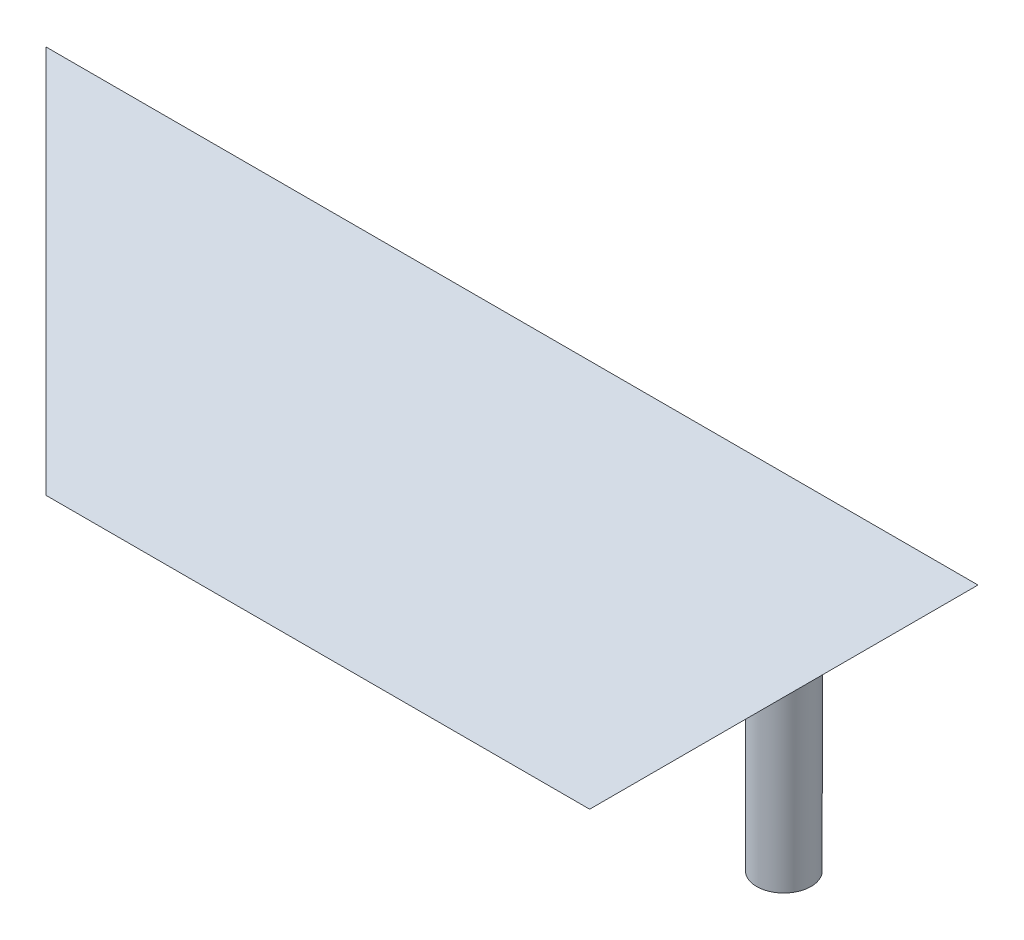
ISO-10303-21;
HEADER;
FILE_DESCRIPTION(('STEP AP214'),'2;1');
FILE_NAME('part.step','',(''),(''),'','','');
FILE_SCHEMA(('AUTOMOTIVE_DESIGN { 1 0 10303 214 1 1 1 1 }'));
ENDSEC;
DATA;
#1=APPLICATION_CONTEXT('core data for automotive mechanical design processes');
#2=APPLICATION_PROTOCOL_DEFINITION('international standard','automotive_design',2000,#1);
#3=PRODUCT_CONTEXT('',#1,'mechanical');
#4=PRODUCT('Part','Part','',(#3));
#5=PRODUCT_RELATED_PRODUCT_CATEGORY('part','',(#4));
#6=PRODUCT_DEFINITION_FORMATION('','',#4);
#7=PRODUCT_DEFINITION_CONTEXT('part definition',#1,'design');
#8=PRODUCT_DEFINITION('design','',#6,#7);
#9=PRODUCT_DEFINITION_SHAPE('','',#8);
#10=(LENGTH_UNIT() NAMED_UNIT(*) SI_UNIT(.MILLI.,.METRE.));
#11=(NAMED_UNIT(*) PLANE_ANGLE_UNIT() SI_UNIT($,.RADIAN.));
#12=(NAMED_UNIT(*) SI_UNIT($,.STERADIAN.) SOLID_ANGLE_UNIT());
#13=UNCERTAINTY_MEASURE_WITH_UNIT(LENGTH_MEASURE(1.E-05),#10,'distance_accuracy_value','');
#14=(GEOMETRIC_REPRESENTATION_CONTEXT(3) GLOBAL_UNCERTAINTY_ASSIGNED_CONTEXT((#13)) GLOBAL_UNIT_ASSIGNED_CONTEXT((#10,
#11,#12)) REPRESENTATION_CONTEXT('',''));
#15=CARTESIAN_POINT('',(0.,0.,0.));
#16=DIRECTION('',(0.,0.,1.));
#17=DIRECTION('',(1.,0.,0.));
#18=AXIS2_PLACEMENT_3D('',#15,#16,#17);
#19=CARTESIAN_POINT('',(-10.,10.,10.));
#20=DIRECTION('',(0.707106781186548,0.707106781186547,0.));
#21=DIRECTION('',(-0.707106781186547,0.707106781186548,0.));
#22=AXIS2_PLACEMENT_3D('',#19,#20,#21);
#23=PLANE('',#22);
#24=CARTESIAN_POINT('',(-3.,3.,3.));
#25=DIRECTION('',(0.707106781186548,0.707106781186547,0.));
#26=DIRECTION('',(0.707106781186547,-0.707106781186548,0.));
#27=AXIS2_PLACEMENT_3D('',#24,#25,#26);
#28=ELLIPSE('',#27,1.97989898732233,1.4);
#29=CARTESIAN_POINT('',(-1.60000000000001,1.60000000000001,3.));
#30=VERTEX_POINT('',#29);
#31=EDGE_CURVE('E107',#30,#30,#28,.T.);
#32=ORIENTED_EDGE('',*,*,#31,.T.);
#33=EDGE_LOOP('',(#32));
#34=FACE_BOUND('',#33,.T.);
#35=DIRECTION('',(0.,0.,-1.));
#36=VECTOR('',#35,1.);
#37=CARTESIAN_POINT('',(0.,0.,10.));
#38=LINE('',#37,#36);
#39=CARTESIAN_POINT('',(0.,0.,10.));
#40=VERTEX_POINT('',#39);
#41=CARTESIAN_POINT('',(0.,0.,0.));
#42=VERTEX_POINT('',#41);
#43=EDGE_CURVE('E69',#40,#42,#38,.T.);
#44=ORIENTED_EDGE('',*,*,#43,.F.);
#45=DIRECTION('',(-0.577350269189625,0.577350269189625,-0.577350269189627));
#46=VECTOR('',#45,1.);
#47=CARTESIAN_POINT('',(0.,0.,10.));
#48=LINE('',#47,#46);
#49=CARTESIAN_POINT('',(-10.,10.,0.));
#50=VERTEX_POINT('',#49);
#51=EDGE_CURVE('E42',#40,#50,#48,.T.);
#52=ORIENTED_EDGE('',*,*,#51,.T.);
#53=DIRECTION('',(0.707106781186547,-0.707106781186548,0.));
#54=VECTOR('',#53,1.);
#55=CARTESIAN_POINT('',(-10.,10.,0.));
#56=LINE('',#55,#54);
#57=EDGE_CURVE('E67',#50,#42,#56,.T.);
#58=ORIENTED_EDGE('',*,*,#57,.T.);
#59=EDGE_LOOP('',(#44,#52,#58));
#60=FACE_BOUND('',#59,.T.);
#61=ADVANCED_FACE('F33',(#34,#60),#23,.F.);
#62=CARTESIAN_POINT('',(0.,0.,10.));
#63=DIRECTION('',(0.,1.,0.));
#64=DIRECTION('',(0.,0.,1.));
#65=AXIS2_PLACEMENT_3D('',#62,#63,#64);
#66=PLANE('',#65);
#67=DIRECTION('',(1.,0.,0.));
#68=VECTOR('',#67,1.);
#69=CARTESIAN_POINT('',(0.,0.,0.));
#70=LINE('',#69,#68);
#71=CARTESIAN_POINT('',(28.,0.,0.));
#72=VERTEX_POINT('',#71);
#73=EDGE_CURVE('E77',#42,#72,#70,.T.);
#74=ORIENTED_EDGE('',*,*,#73,.T.);
#75=DIRECTION('',(0.,0.,-1.));
#76=VECTOR('',#75,1.);
#77=CARTESIAN_POINT('',(28.,0.,10.));
#78=LINE('',#77,#76);
#79=CARTESIAN_POINT('',(28.,0.,10.));
#80=VERTEX_POINT('',#79);
#81=EDGE_CURVE('E82',#80,#72,#78,.T.);
#82=ORIENTED_EDGE('',*,*,#81,.F.);
#83=DIRECTION('',(1.,0.,0.));
#84=VECTOR('',#83,1.);
#85=CARTESIAN_POINT('',(0.,0.,10.));
#86=LINE('',#85,#84);
#87=EDGE_CURVE('E80',#40,#80,#86,.T.);
#88=ORIENTED_EDGE('',*,*,#87,.F.);
#89=ORIENTED_EDGE('',*,*,#43,.T.);
#90=EDGE_LOOP('',(#74,#82,#88,#89));
#91=FACE_BOUND('',#90,.T.);
#92=ADVANCED_FACE('F89',(#91),#66,.F.);
#93=CARTESIAN_POINT('',(28.,0.,10.));
#94=DIRECTION('',(-0.707106781186547,0.707106781186548,0.));
#95=DIRECTION('',(-0.707106781186548,-0.707106781186547,0.));
#96=AXIS2_PLACEMENT_3D('',#93,#94,#95);
#97=PLANE('',#96);
#98=CARTESIAN_POINT('',(31.,3.,3.));
#99=DIRECTION('',(-0.707106781186547,0.707106781186548,0.));
#100=DIRECTION('',(-0.707106781186548,-0.707106781186547,0.));
#101=AXIS2_PLACEMENT_3D('',#98,#99,#100);
#102=ELLIPSE('',#101,1.97989898732233,1.4);
#103=CARTESIAN_POINT('',(29.6,1.6,3.));
#104=VERTEX_POINT('',#103);
#105=EDGE_CURVE('E78',#104,#104,#102,.T.);
#106=ORIENTED_EDGE('',*,*,#105,.T.);
#107=EDGE_LOOP('',(#106));
#108=FACE_BOUND('',#107,.T.);
#109=DIRECTION('',(0.707106781186548,0.707106781186547,0.));
#110=VECTOR('',#109,1.);
#111=CARTESIAN_POINT('',(28.,0.,0.));
#112=LINE('',#111,#110);
#113=CARTESIAN_POINT('',(38.,10.,0.));
#114=VERTEX_POINT('',#113);
#115=EDGE_CURVE('E60',#72,#114,#112,.T.);
#116=ORIENTED_EDGE('',*,*,#115,.T.);
#117=DIRECTION('',(-0.577350269189625,-0.577350269189625,0.577350269189627));
#118=VECTOR('',#117,1.);
#119=CARTESIAN_POINT('',(18.6666666666667,-9.33333333333332,19.3333333333333));
#120=LINE('',#119,#118);
#121=EDGE_CURVE('E11',#114,#80,#120,.T.);
#122=ORIENTED_EDGE('',*,*,#121,.T.);
#123=ORIENTED_EDGE('',*,*,#81,.T.);
#124=EDGE_LOOP('',(#116,#122,#123));
#125=FACE_BOUND('',#124,.T.);
#126=ADVANCED_FACE('F90',(#108,#125),#97,.F.);
#127=CARTESIAN_POINT('',(0.,0.,0.));
#128=DIRECTION('',(0.,0.,1.));
#129=DIRECTION('',(1.,0.,0.));
#130=AXIS2_PLACEMENT_3D('',#127,#128,#129);
#131=PLANE('',#130);
#132=ORIENTED_EDGE('',*,*,#57,.F.);
#133=DIRECTION('',(-1.,0.,0.));
#134=VECTOR('',#133,1.);
#135=CARTESIAN_POINT('',(38.,10.,0.));
#136=LINE('',#135,#134);
#137=EDGE_CURVE('E76',#114,#50,#136,.T.);
#138=ORIENTED_EDGE('',*,*,#137,.F.);
#139=ORIENTED_EDGE('',*,*,#115,.F.);
#140=ORIENTED_EDGE('',*,*,#73,.F.);
#141=EDGE_LOOP('',(#132,#138,#139,#140));
#142=FACE_BOUND('',#141,.T.);
#143=ADVANCED_FACE('F75',(#142),#131,.F.);
#144=CARTESIAN_POINT('',(0.,0.,10.));
#145=DIRECTION('',(0.,0.707106781186549,0.707106781186546));
#146=DIRECTION('',(1.,0.,0.));
#147=AXIS2_PLACEMENT_3D('',#144,#145,#146);
#148=PLANE('',#147);
#149=ORIENTED_EDGE('',*,*,#121,.F.);
#150=ORIENTED_EDGE('',*,*,#137,.T.);
#151=ORIENTED_EDGE('',*,*,#51,.F.);
#152=ORIENTED_EDGE('',*,*,#87,.T.);
#153=EDGE_LOOP('',(#149,#150,#151,#152));
#154=FACE_BOUND('',#153,.T.);
#155=ADVANCED_FACE('F35',(#154),#148,.T.);
#156=CARTESIAN_POINT('',(31.,10.,3.));
#157=DIRECTION('',(0.,-1.,0.));
#158=DIRECTION('',(0.,0.,-1.));
#159=AXIS2_PLACEMENT_3D('',#156,#157,#158);
#160=CYLINDRICAL_SURFACE('',#159,1.4);
#161=CARTESIAN_POINT('',(31.,-4.75,3.));
#162=DIRECTION('',(0.,-1.,0.));
#163=DIRECTION('',(0.,0.,-1.));
#164=AXIS2_PLACEMENT_3D('',#161,#162,#163);
#165=CIRCLE('',#164,1.4);
#166=CARTESIAN_POINT('',(31.,-4.75,1.6));
#167=VERTEX_POINT('',#166);
#168=EDGE_CURVE('E109',#167,#167,#165,.T.);
#169=ORIENTED_EDGE('',*,*,#168,.F.);
#170=EDGE_LOOP('',(#169));
#171=FACE_BOUND('',#170,.T.);
#172=ORIENTED_EDGE('',*,*,#105,.F.);
#173=EDGE_LOOP('',(#172));
#174=FACE_BOUND('',#173,.T.);
#175=ADVANCED_FACE('F119',(#171,#174),#160,.T.);
#176=CARTESIAN_POINT('',(31.,-4.75,3.));
#177=DIRECTION('',(0.,-1.,0.));
#178=DIRECTION('',(0.,0.,-1.));
#179=AXIS2_PLACEMENT_3D('',#176,#177,#178);
#180=PLANE('',#179);
#181=ORIENTED_EDGE('',*,*,#168,.T.);
#182=EDGE_LOOP('',(#181));
#183=FACE_BOUND('',#182,.T.);
#184=ADVANCED_FACE('F121',(#183),#180,.T.);
#185=CARTESIAN_POINT('',(-3.,10.,3.));
#186=DIRECTION('',(0.,-1.,0.));
#187=DIRECTION('',(0.,0.,-1.));
#188=AXIS2_PLACEMENT_3D('',#185,#186,#187);
#189=CYLINDRICAL_SURFACE('',#188,1.4);
#190=CARTESIAN_POINT('',(-3.,-4.75,3.));
#191=DIRECTION('',(0.,-1.,0.));
#192=DIRECTION('',(0.,0.,1.));
#193=AXIS2_PLACEMENT_3D('',#190,#191,#192);
#194=CIRCLE('',#193,1.4);
#195=CARTESIAN_POINT('',(-3.,-4.75,4.4));
#196=VERTEX_POINT('',#195);
#197=EDGE_CURVE('E110',#196,#196,#194,.T.);
#198=ORIENTED_EDGE('',*,*,#197,.F.);
#199=EDGE_LOOP('',(#198));
#200=FACE_BOUND('',#199,.T.);
#201=ORIENTED_EDGE('',*,*,#31,.F.);
#202=EDGE_LOOP('',(#201));
#203=FACE_BOUND('',#202,.T.);
#204=ADVANCED_FACE('F128',(#200,#203),#189,.T.);
#205=CARTESIAN_POINT('',(-3.,-4.75,3.));
#206=DIRECTION('',(0.,1.,0.));
#207=DIRECTION('',(0.,0.,1.));
#208=AXIS2_PLACEMENT_3D('',#205,#206,#207);
#209=PLANE('',#208);
#210=ORIENTED_EDGE('',*,*,#197,.T.);
#211=EDGE_LOOP('',(#210));
#212=FACE_BOUND('',#211,.T.);
#213=ADVANCED_FACE('F135',(#212),#209,.F.);
#214=CLOSED_SHELL('',(#61,#92,#126,#143,#155,#175,#184,#204,#213));
#215=MANIFOLD_SOLID_BREP('B2',#214);
#216=ADVANCED_BREP_SHAPE_REPRESENTATION('',(#18,#215),#14);
#217=SHAPE_DEFINITION_REPRESENTATION(#9,#216);
ENDSEC;
END-ISO-10303-21;
